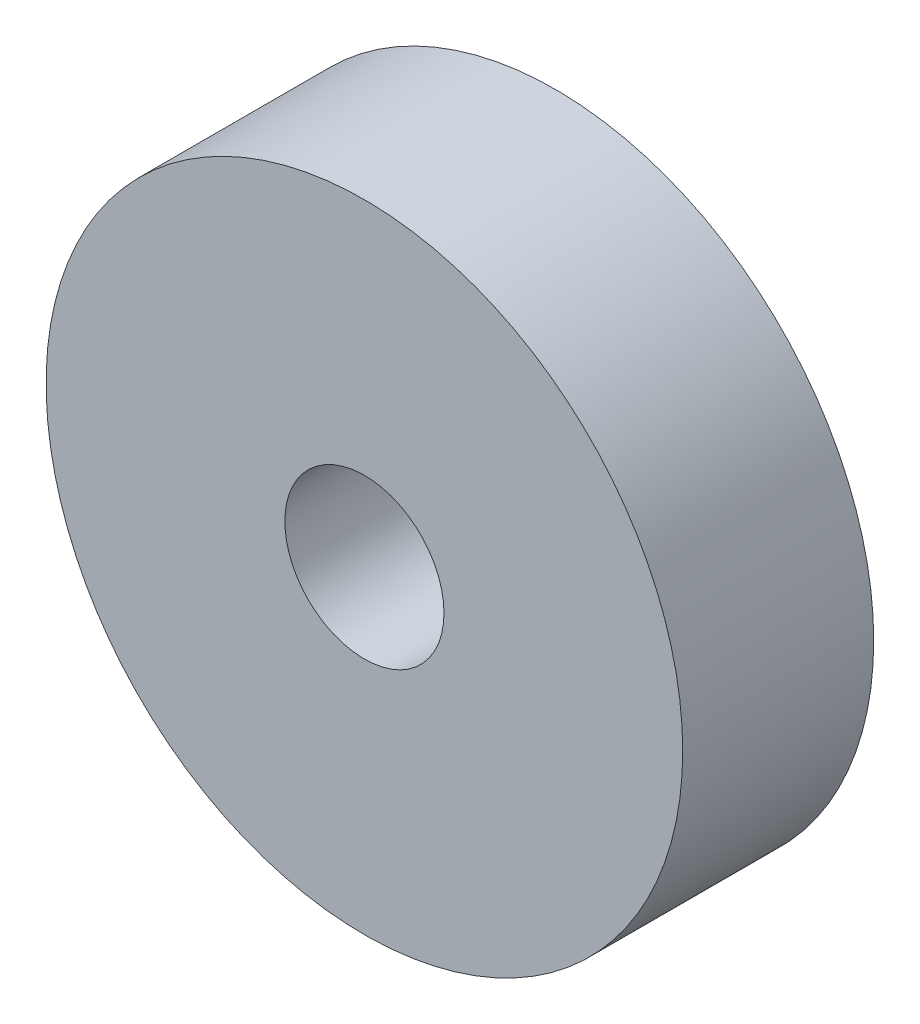
ISO-10303-21;
HEADER;
FILE_DESCRIPTION(('STEP AP214'),'2;1');
FILE_NAME('part.step','',(''),(''),'','','');
FILE_SCHEMA(('AUTOMOTIVE_DESIGN { 1 0 10303 214 1 1 1 1 }'));
ENDSEC;
DATA;
#1=APPLICATION_CONTEXT('core data for automotive mechanical design processes');
#2=APPLICATION_PROTOCOL_DEFINITION('international standard','automotive_design',2000,#1);
#3=PRODUCT_CONTEXT('',#1,'mechanical');
#4=PRODUCT('Part','Part','',(#3));
#5=PRODUCT_RELATED_PRODUCT_CATEGORY('part','',(#4));
#6=PRODUCT_DEFINITION_FORMATION('','',#4);
#7=PRODUCT_DEFINITION_CONTEXT('part definition',#1,'design');
#8=PRODUCT_DEFINITION('design','',#6,#7);
#9=PRODUCT_DEFINITION_SHAPE('','',#8);
#10=(LENGTH_UNIT() NAMED_UNIT(*) SI_UNIT(.MILLI.,.METRE.));
#11=(NAMED_UNIT(*) PLANE_ANGLE_UNIT() SI_UNIT($,.RADIAN.));
#12=(NAMED_UNIT(*) SI_UNIT($,.STERADIAN.) SOLID_ANGLE_UNIT());
#13=UNCERTAINTY_MEASURE_WITH_UNIT(LENGTH_MEASURE(1.E-05),#10,'distance_accuracy_value','');
#14=(GEOMETRIC_REPRESENTATION_CONTEXT(3) GLOBAL_UNCERTAINTY_ASSIGNED_CONTEXT((#13)) GLOBAL_UNIT_ASSIGNED_CONTEXT((#10,
#11,#12)) REPRESENTATION_CONTEXT('',''));
#15=CARTESIAN_POINT('',(0.,0.,0.));
#16=DIRECTION('',(0.,0.,1.));
#17=DIRECTION('',(1.,0.,0.));
#18=AXIS2_PLACEMENT_3D('',#15,#16,#17);
#19=CARTESIAN_POINT('',(0.,0.,3.));
#20=DIRECTION('',(0.,0.,1.));
#21=DIRECTION('',(1.,0.,0.));
#22=AXIS2_PLACEMENT_3D('',#19,#20,#21);
#23=PLANE('',#22);
#24=CARTESIAN_POINT('',(0.,0.,3.));
#25=DIRECTION('',(0.,0.,1.));
#26=DIRECTION('',(1.,0.,0.));
#27=AXIS2_PLACEMENT_3D('',#24,#25,#26);
#28=CIRCLE('',#27,5.);
#29=CARTESIAN_POINT('',(5.,0.,3.));
#30=VERTEX_POINT('',#29);
#31=EDGE_CURVE('E10',#30,#30,#28,.T.);
#32=ORIENTED_EDGE('',*,*,#31,.T.);
#33=EDGE_LOOP('',(#32));
#34=FACE_BOUND('',#33,.T.);
#35=CARTESIAN_POINT('',(0.,0.,3.));
#36=DIRECTION('',(0.,0.,1.));
#37=DIRECTION('',(1.,0.,0.));
#38=AXIS2_PLACEMENT_3D('',#35,#36,#37);
#39=CIRCLE('',#38,1.25);
#40=CARTESIAN_POINT('',(1.25,0.,3.));
#41=VERTEX_POINT('',#40);
#42=EDGE_CURVE('E42',#41,#41,#39,.T.);
#43=ORIENTED_EDGE('',*,*,#42,.F.);
#44=EDGE_LOOP('',(#43));
#45=FACE_BOUND('',#44,.T.);
#46=ADVANCED_FACE('F31',(#34,#45),#23,.T.);
#47=CARTESIAN_POINT('',(0.,0.,0.));
#48=DIRECTION('',(0.,0.,1.));
#49=DIRECTION('',(1.,0.,0.));
#50=AXIS2_PLACEMENT_3D('',#47,#48,#49);
#51=PLANE('',#50);
#52=CARTESIAN_POINT('',(0.,0.,0.));
#53=DIRECTION('',(0.,0.,1.));
#54=DIRECTION('',(1.,0.,0.));
#55=AXIS2_PLACEMENT_3D('',#52,#53,#54);
#56=CIRCLE('',#55,5.);
#57=CARTESIAN_POINT('',(5.,0.,0.));
#58=VERTEX_POINT('',#57);
#59=EDGE_CURVE('E35',#58,#58,#56,.T.);
#60=ORIENTED_EDGE('',*,*,#59,.F.);
#61=EDGE_LOOP('',(#60));
#62=FACE_BOUND('',#61,.T.);
#63=CARTESIAN_POINT('',(0.,0.,0.));
#64=DIRECTION('',(0.,0.,1.));
#65=DIRECTION('',(1.,0.,0.));
#66=AXIS2_PLACEMENT_3D('',#63,#64,#65);
#67=CIRCLE('',#66,1.25);
#68=CARTESIAN_POINT('',(1.25,0.,0.));
#69=VERTEX_POINT('',#68);
#70=EDGE_CURVE('E44',#69,#69,#67,.T.);
#71=ORIENTED_EDGE('',*,*,#70,.T.);
#72=EDGE_LOOP('',(#71));
#73=FACE_BOUND('',#72,.T.);
#74=ADVANCED_FACE('F54',(#62,#73),#51,.F.);
#75=CARTESIAN_POINT('',(0.,0.,3.));
#76=DIRECTION('',(0.,0.,-1.));
#77=DIRECTION('',(-1.,0.,0.));
#78=AXIS2_PLACEMENT_3D('',#75,#76,#77);
#79=CYLINDRICAL_SURFACE('',#78,5.);
#80=ORIENTED_EDGE('',*,*,#31,.F.);
#81=EDGE_LOOP('',(#80));
#82=FACE_BOUND('',#81,.T.);
#83=ORIENTED_EDGE('',*,*,#59,.T.);
#84=EDGE_LOOP('',(#83));
#85=FACE_BOUND('',#84,.T.);
#86=ADVANCED_FACE('F33',(#82,#85),#79,.T.);
#87=CARTESIAN_POINT('',(0.,0.,3.));
#88=DIRECTION('',(0.,0.,-1.));
#89=DIRECTION('',(-1.,0.,0.));
#90=AXIS2_PLACEMENT_3D('',#87,#88,#89);
#91=CYLINDRICAL_SURFACE('',#90,1.25);
#92=ORIENTED_EDGE('',*,*,#42,.T.);
#93=EDGE_LOOP('',(#92));
#94=FACE_BOUND('',#93,.T.);
#95=ORIENTED_EDGE('',*,*,#70,.F.);
#96=EDGE_LOOP('',(#95));
#97=FACE_BOUND('',#96,.T.);
#98=ADVANCED_FACE('F50',(#94,#97),#91,.F.);
#99=CLOSED_SHELL('',(#46,#74,#86,#98));
#100=MANIFOLD_SOLID_BREP('B2',#99);
#101=ADVANCED_BREP_SHAPE_REPRESENTATION('',(#18,#100),#14);
#102=SHAPE_DEFINITION_REPRESENTATION(#9,#101);
ENDSEC;
END-ISO-10303-21;
